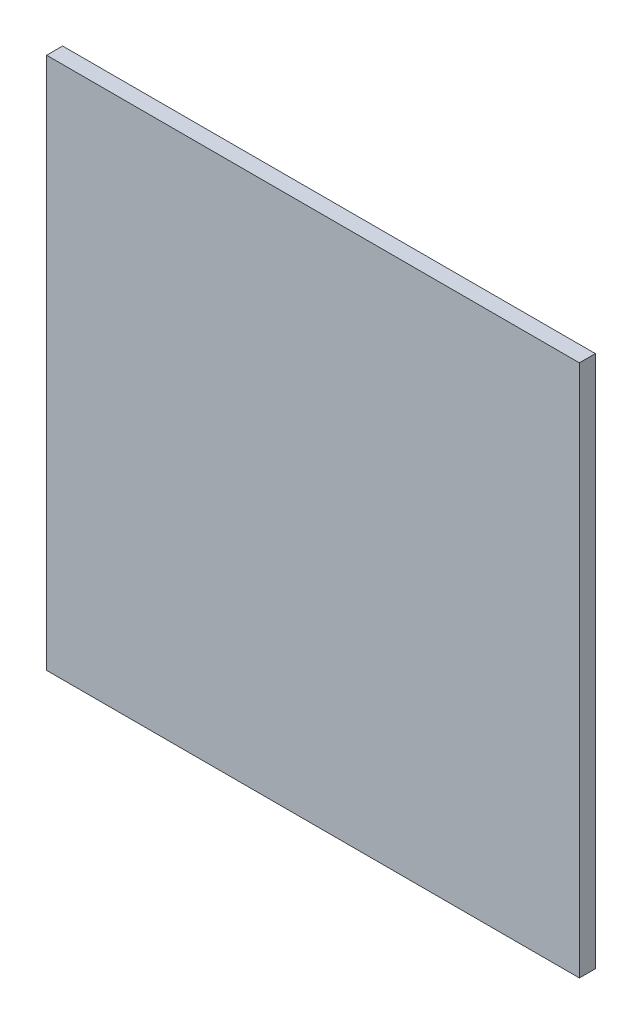
ISO-10303-21;
HEADER;
FILE_DESCRIPTION(('STEP AP214'),'2;1');
FILE_NAME('part.step','',(''),(''),'','','');
FILE_SCHEMA(('AUTOMOTIVE_DESIGN { 1 0 10303 214 1 1 1 1 }'));
ENDSEC;
DATA;
#1=APPLICATION_CONTEXT('core data for automotive mechanical design processes');
#2=APPLICATION_PROTOCOL_DEFINITION('international standard','automotive_design',2000,#1);
#3=PRODUCT_CONTEXT('',#1,'mechanical');
#4=PRODUCT('Part','Part','',(#3));
#5=PRODUCT_RELATED_PRODUCT_CATEGORY('part','',(#4));
#6=PRODUCT_DEFINITION_FORMATION('','',#4);
#7=PRODUCT_DEFINITION_CONTEXT('part definition',#1,'design');
#8=PRODUCT_DEFINITION('design','',#6,#7);
#9=PRODUCT_DEFINITION_SHAPE('','',#8);
#10=(LENGTH_UNIT() NAMED_UNIT(*) SI_UNIT(.MILLI.,.METRE.));
#11=(NAMED_UNIT(*) PLANE_ANGLE_UNIT() SI_UNIT($,.RADIAN.));
#12=(NAMED_UNIT(*) SI_UNIT($,.STERADIAN.) SOLID_ANGLE_UNIT());
#13=UNCERTAINTY_MEASURE_WITH_UNIT(LENGTH_MEASURE(1.E-05),#10,'distance_accuracy_value','');
#14=(GEOMETRIC_REPRESENTATION_CONTEXT(3) GLOBAL_UNCERTAINTY_ASSIGNED_CONTEXT((#13)) GLOBAL_UNIT_ASSIGNED_CONTEXT((#10,
#11,#12)) REPRESENTATION_CONTEXT('',''));
#15=CARTESIAN_POINT('',(0.,0.,0.));
#16=DIRECTION('',(0.,0.,1.));
#17=DIRECTION('',(1.,0.,0.));
#18=AXIS2_PLACEMENT_3D('',#15,#16,#17);
#19=CARTESIAN_POINT('',(50.,-50.,3.));
#20=DIRECTION('',(-1.,0.,0.));
#21=DIRECTION('',(0.,0.,1.));
#22=AXIS2_PLACEMENT_3D('',#19,#20,#21);
#23=PLANE('',#22);
#24=DIRECTION('',(0.,1.,0.));
#25=VECTOR('',#24,1.);
#26=CARTESIAN_POINT('',(50.,-50.,0.));
#27=LINE('',#26,#25);
#28=CARTESIAN_POINT('',(50.,-50.,0.));
#29=VERTEX_POINT('',#28);
#30=CARTESIAN_POINT('',(50.,50.,0.));
#31=VERTEX_POINT('',#30);
#32=EDGE_CURVE('E113',#29,#31,#27,.T.);
#33=ORIENTED_EDGE('',*,*,#32,.T.);
#34=DIRECTION('',(0.,0.,-1.));
#35=VECTOR('',#34,1.);
#36=CARTESIAN_POINT('',(50.,50.,3.));
#37=LINE('',#36,#35);
#38=CARTESIAN_POINT('',(50.,50.,3.));
#39=VERTEX_POINT('',#38);
#40=EDGE_CURVE('E11',#39,#31,#37,.T.);
#41=ORIENTED_EDGE('',*,*,#40,.F.);
#42=DIRECTION('',(0.,1.,0.));
#43=VECTOR('',#42,1.);
#44=CARTESIAN_POINT('',(50.,-50.,3.));
#45=LINE('',#44,#43);
#46=CARTESIAN_POINT('',(50.,-50.,3.));
#47=VERTEX_POINT('',#46);
#48=EDGE_CURVE('E97',#47,#39,#45,.T.);
#49=ORIENTED_EDGE('',*,*,#48,.F.);
#50=DIRECTION('',(0.,0.,-1.));
#51=VECTOR('',#50,1.);
#52=CARTESIAN_POINT('',(50.,-50.,3.));
#53=LINE('',#52,#51);
#54=EDGE_CURVE('E109',#47,#29,#53,.T.);
#55=ORIENTED_EDGE('',*,*,#54,.T.);
#56=EDGE_LOOP('',(#33,#41,#49,#55));
#57=FACE_BOUND('',#56,.T.);
#58=ADVANCED_FACE('F45',(#57),#23,.F.);
#59=CARTESIAN_POINT('',(-50.,50.,3.));
#60=DIRECTION('',(0.,-1.,0.));
#61=DIRECTION('',(0.,0.,-1.));
#62=AXIS2_PLACEMENT_3D('',#59,#60,#61);
#63=PLANE('',#62);
#64=DIRECTION('',(-1.,0.,0.));
#65=VECTOR('',#64,1.);
#66=CARTESIAN_POINT('',(-50.,50.,0.));
#67=LINE('',#66,#65);
#68=CARTESIAN_POINT('',(-50.,50.,0.));
#69=VERTEX_POINT('',#68);
#70=EDGE_CURVE('E102',#31,#69,#67,.T.);
#71=ORIENTED_EDGE('',*,*,#70,.T.);
#72=DIRECTION('',(0.,0.,-1.));
#73=VECTOR('',#72,1.);
#74=CARTESIAN_POINT('',(-50.,50.,3.));
#75=LINE('',#74,#73);
#76=CARTESIAN_POINT('',(-50.,50.,3.));
#77=VERTEX_POINT('',#76);
#78=EDGE_CURVE('E54',#77,#69,#75,.T.);
#79=ORIENTED_EDGE('',*,*,#78,.F.);
#80=DIRECTION('',(-1.,0.,0.));
#81=VECTOR('',#80,1.);
#82=CARTESIAN_POINT('',(-50.,50.,3.));
#83=LINE('',#82,#81);
#84=EDGE_CURVE('E92',#39,#77,#83,.T.);
#85=ORIENTED_EDGE('',*,*,#84,.F.);
#86=ORIENTED_EDGE('',*,*,#40,.T.);
#87=EDGE_LOOP('',(#71,#79,#85,#86));
#88=FACE_BOUND('',#87,.T.);
#89=ADVANCED_FACE('F101',(#88),#63,.F.);
#90=CARTESIAN_POINT('',(-50.,-50.,3.));
#91=DIRECTION('',(1.,0.,0.));
#92=DIRECTION('',(0.,0.,-1.));
#93=AXIS2_PLACEMENT_3D('',#90,#91,#92);
#94=PLANE('',#93);
#95=DIRECTION('',(0.,-1.,0.));
#96=VECTOR('',#95,1.);
#97=CARTESIAN_POINT('',(-50.,-50.,0.));
#98=LINE('',#97,#96);
#99=CARTESIAN_POINT('',(-50.,-50.,0.));
#100=VERTEX_POINT('',#99);
#101=EDGE_CURVE('E79',#69,#100,#98,.T.);
#102=ORIENTED_EDGE('',*,*,#101,.T.);
#103=DIRECTION('',(0.,0.,-1.));
#104=VECTOR('',#103,1.);
#105=CARTESIAN_POINT('',(-50.,-50.,3.));
#106=LINE('',#105,#104);
#107=CARTESIAN_POINT('',(-50.,-50.,3.));
#108=VERTEX_POINT('',#107);
#109=EDGE_CURVE('E104',#108,#100,#106,.T.);
#110=ORIENTED_EDGE('',*,*,#109,.F.);
#111=DIRECTION('',(0.,-1.,0.));
#112=VECTOR('',#111,1.);
#113=CARTESIAN_POINT('',(-50.,-50.,3.));
#114=LINE('',#113,#112);
#115=EDGE_CURVE('E95',#77,#108,#114,.T.);
#116=ORIENTED_EDGE('',*,*,#115,.F.);
#117=ORIENTED_EDGE('',*,*,#78,.T.);
#118=EDGE_LOOP('',(#102,#110,#116,#117));
#119=FACE_BOUND('',#118,.T.);
#120=ADVANCED_FACE('F105',(#119),#94,.F.);
#121=CARTESIAN_POINT('',(-50.,-50.,3.));
#122=DIRECTION('',(0.,1.,0.));
#123=DIRECTION('',(0.,0.,1.));
#124=AXIS2_PLACEMENT_3D('',#121,#122,#123);
#125=PLANE('',#124);
#126=DIRECTION('',(1.,0.,0.));
#127=VECTOR('',#126,1.);
#128=CARTESIAN_POINT('',(-50.,-50.,0.));
#129=LINE('',#128,#127);
#130=EDGE_CURVE('E85',#100,#29,#129,.T.);
#131=ORIENTED_EDGE('',*,*,#130,.T.);
#132=ORIENTED_EDGE('',*,*,#54,.F.);
#133=DIRECTION('',(1.,0.,0.));
#134=VECTOR('',#133,1.);
#135=CARTESIAN_POINT('',(-50.,-50.,3.));
#136=LINE('',#135,#134);
#137=EDGE_CURVE('E62',#108,#47,#136,.T.);
#138=ORIENTED_EDGE('',*,*,#137,.F.);
#139=ORIENTED_EDGE('',*,*,#109,.T.);
#140=EDGE_LOOP('',(#131,#132,#138,#139));
#141=FACE_BOUND('',#140,.T.);
#142=ADVANCED_FACE('F126',(#141),#125,.F.);
#143=CARTESIAN_POINT('',(0.,0.,3.));
#144=DIRECTION('',(0.,0.,-1.));
#145=DIRECTION('',(-1.,0.,0.));
#146=AXIS2_PLACEMENT_3D('',#143,#144,#145);
#147=PLANE('',#146);
#148=ORIENTED_EDGE('',*,*,#48,.T.);
#149=ORIENTED_EDGE('',*,*,#84,.T.);
#150=ORIENTED_EDGE('',*,*,#115,.T.);
#151=ORIENTED_EDGE('',*,*,#137,.T.);
#152=EDGE_LOOP('',(#148,#149,#150,#151));
#153=FACE_BOUND('',#152,.T.);
#154=ADVANCED_FACE('F93',(#153),#147,.F.);
#155=CARTESIAN_POINT('',(0.,0.,0.));
#156=DIRECTION('',(0.,0.,-1.));
#157=DIRECTION('',(-1.,0.,0.));
#158=AXIS2_PLACEMENT_3D('',#155,#156,#157);
#159=PLANE('',#158);
#160=ORIENTED_EDGE('',*,*,#32,.F.);
#161=ORIENTED_EDGE('',*,*,#130,.F.);
#162=ORIENTED_EDGE('',*,*,#101,.F.);
#163=ORIENTED_EDGE('',*,*,#70,.F.);
#164=EDGE_LOOP('',(#160,#161,#162,#163));
#165=FACE_BOUND('',#164,.T.);
#166=ADVANCED_FACE('F129',(#165),#159,.T.);
#167=CLOSED_SHELL('',(#58,#89,#120,#142,#154,#166));
#168=MANIFOLD_SOLID_BREP('B2',#167);
#169=ADVANCED_BREP_SHAPE_REPRESENTATION('',(#18,#168),#14);
#170=SHAPE_DEFINITION_REPRESENTATION(#9,#169);
ENDSEC;
END-ISO-10303-21;
